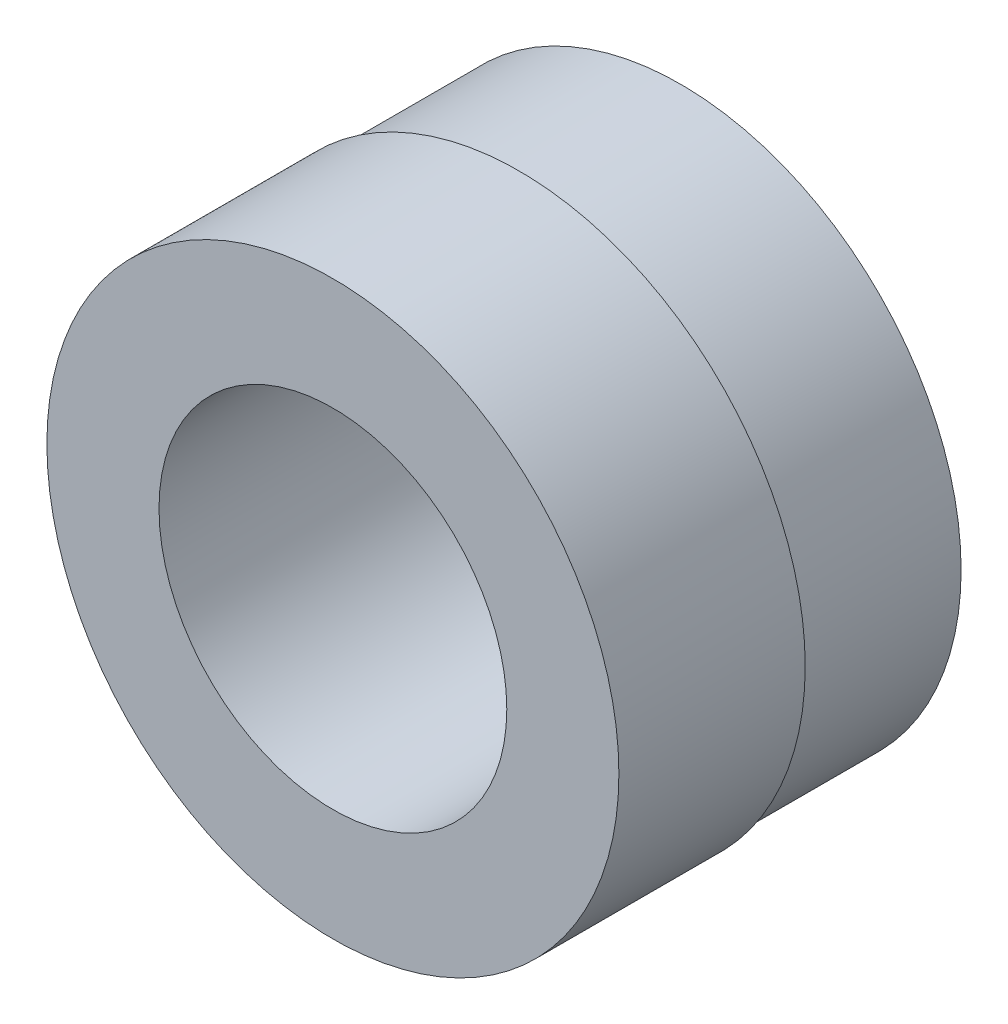
ISO-10303-21;
HEADER;
FILE_DESCRIPTION(('STEP AP214'),'2;1');
FILE_NAME('part.step','',(''),(''),'','','');
FILE_SCHEMA(('AUTOMOTIVE_DESIGN { 1 0 10303 214 1 1 1 1 }'));
ENDSEC;
DATA;
#1=APPLICATION_CONTEXT('core data for automotive mechanical design processes');
#2=APPLICATION_PROTOCOL_DEFINITION('international standard','automotive_design',2000,#1);
#3=PRODUCT_CONTEXT('',#1,'mechanical');
#4=PRODUCT('Part','Part','',(#3));
#5=PRODUCT_RELATED_PRODUCT_CATEGORY('part','',(#4));
#6=PRODUCT_DEFINITION_FORMATION('','',#4);
#7=PRODUCT_DEFINITION_CONTEXT('part definition',#1,'design');
#8=PRODUCT_DEFINITION('design','',#6,#7);
#9=PRODUCT_DEFINITION_SHAPE('','',#8);
#10=(LENGTH_UNIT() NAMED_UNIT(*) SI_UNIT(.MILLI.,.METRE.));
#11=(NAMED_UNIT(*) PLANE_ANGLE_UNIT() SI_UNIT($,.RADIAN.));
#12=(NAMED_UNIT(*) SI_UNIT($,.STERADIAN.) SOLID_ANGLE_UNIT());
#13=UNCERTAINTY_MEASURE_WITH_UNIT(LENGTH_MEASURE(1.E-05),#10,'distance_accuracy_value','');
#14=(GEOMETRIC_REPRESENTATION_CONTEXT(3) GLOBAL_UNCERTAINTY_ASSIGNED_CONTEXT((#13)) GLOBAL_UNIT_ASSIGNED_CONTEXT((#10,
#11,#12)) REPRESENTATION_CONTEXT('',''));
#15=CARTESIAN_POINT('',(0.,0.,0.));
#16=DIRECTION('',(0.,0.,1.));
#17=DIRECTION('',(1.,0.,0.));
#18=AXIS2_PLACEMENT_3D('',#15,#16,#17);
#19=CARTESIAN_POINT('',(23.025,0.,13.));
#20=DIRECTION('',(0.,0.,-1.));
#21=DIRECTION('',(-1.,0.,0.));
#22=AXIS2_PLACEMENT_3D('',#19,#20,#21);
#23=PLANE('',#22);
#24=CARTESIAN_POINT('',(0.,0.,13.));
#25=DIRECTION('',(0.,0.,1.));
#26=DIRECTION('',(1.,0.,0.));
#27=AXIS2_PLACEMENT_3D('',#24,#25,#26);
#28=CIRCLE('',#27,23.025);
#29=CARTESIAN_POINT('',(23.025,0.,13.));
#30=VERTEX_POINT('',#29);
#31=EDGE_CURVE('E11',#30,#30,#28,.T.);
#32=ORIENTED_EDGE('',*,*,#31,.F.);
#33=EDGE_LOOP('',(#32));
#34=FACE_BOUND('',#33,.T.);
#35=CARTESIAN_POINT('',(0.,0.,13.));
#36=DIRECTION('',(0.,0.,-1.));
#37=DIRECTION('',(-1.,0.,0.));
#38=AXIS2_PLACEMENT_3D('',#35,#36,#37);
#39=CIRCLE('',#38,22.575);
#40=CARTESIAN_POINT('',(22.575,0.,13.));
#41=VERTEX_POINT('',#40);
#42=EDGE_CURVE('E101',#41,#41,#39,.T.);
#43=ORIENTED_EDGE('',*,*,#42,.F.);
#44=EDGE_LOOP('',(#43));
#45=FACE_BOUND('',#44,.T.);
#46=ADVANCED_FACE('F35',(#34,#45),#23,.T.);
#47=CARTESIAN_POINT('',(0.,0.,13.));
#48=DIRECTION('',(0.,0.,1.));
#49=DIRECTION('',(1.,0.,0.));
#50=AXIS2_PLACEMENT_3D('',#47,#48,#49);
#51=CYLINDRICAL_SURFACE('',#50,23.025);
#52=ORIENTED_EDGE('',*,*,#31,.T.);
#53=EDGE_LOOP('',(#52));
#54=FACE_BOUND('',#53,.T.);
#55=CARTESIAN_POINT('',(0.,0.,28.));
#56=DIRECTION('',(0.,0.,1.));
#57=DIRECTION('',(1.,0.,0.));
#58=AXIS2_PLACEMENT_3D('',#55,#56,#57);
#59=CIRCLE('',#58,23.025);
#60=CARTESIAN_POINT('',(23.025,0.,28.));
#61=VERTEX_POINT('',#60);
#62=EDGE_CURVE('E43',#61,#61,#59,.T.);
#63=ORIENTED_EDGE('',*,*,#62,.F.);
#64=EDGE_LOOP('',(#63));
#65=FACE_BOUND('',#64,.T.);
#66=ADVANCED_FACE('F37',(#54,#65),#51,.T.);
#67=CARTESIAN_POINT('',(0.,0.,28.));
#68=DIRECTION('',(0.,0.,1.));
#69=DIRECTION('',(1.,0.,0.));
#70=AXIS2_PLACEMENT_3D('',#67,#68,#69);
#71=PLANE('',#70);
#72=CARTESIAN_POINT('',(0.,0.,28.));
#73=DIRECTION('',(0.,0.,1.));
#74=DIRECTION('',(1.,0.,0.));
#75=AXIS2_PLACEMENT_3D('',#72,#73,#74);
#76=CIRCLE('',#75,14.);
#77=CARTESIAN_POINT('',(14.,0.,28.));
#78=VERTEX_POINT('',#77);
#79=EDGE_CURVE('E89',#78,#78,#76,.T.);
#80=ORIENTED_EDGE('',*,*,#79,.F.);
#81=EDGE_LOOP('',(#80));
#82=FACE_BOUND('',#81,.T.);
#83=ORIENTED_EDGE('',*,*,#62,.T.);
#84=EDGE_LOOP('',(#83));
#85=FACE_BOUND('',#84,.T.);
#86=ADVANCED_FACE('F109',(#82,#85),#71,.T.);
#87=CARTESIAN_POINT('',(0.,0.,0.));
#88=DIRECTION('',(0.,0.,1.));
#89=DIRECTION('',(1.,0.,0.));
#90=AXIS2_PLACEMENT_3D('',#87,#88,#89);
#91=CYLINDRICAL_SURFACE('',#90,22.575);
#92=CARTESIAN_POINT('',(0.,0.,0.));
#93=DIRECTION('',(0.,0.,-1.));
#94=DIRECTION('',(-1.,0.,0.));
#95=AXIS2_PLACEMENT_3D('',#92,#93,#94);
#96=CIRCLE('',#95,22.575);
#97=CARTESIAN_POINT('',(22.575,0.,0.));
#98=VERTEX_POINT('',#97);
#99=EDGE_CURVE('E102',#98,#98,#96,.T.);
#100=CARTESIAN_POINT('',(22.575,0.,0.));
#101=CARTESIAN_POINT('',(22.575,0.,0.135416666666667));
#102=CARTESIAN_POINT('',(22.575,0.,0.270833333333333));
#103=CARTESIAN_POINT('',(22.575,0.,0.541666666666667));
#104=CARTESIAN_POINT('',(22.575,0.,0.677083333333334));
#105=CARTESIAN_POINT('',(22.575,0.,0.947916666666667));
#106=CARTESIAN_POINT('',(22.575,0.,1.08333333333333));
#107=CARTESIAN_POINT('',(22.575,0.,1.35416666666667));
#108=CARTESIAN_POINT('',(22.575,0.,1.48958333333333));
#109=CARTESIAN_POINT('',(22.575,0.,1.76041666666667));
#110=CARTESIAN_POINT('',(22.575,0.,1.89583333333333));
#111=CARTESIAN_POINT('',(22.575,0.,2.16666666666667));
#112=CARTESIAN_POINT('',(22.575,0.,2.30208333333333));
#113=CARTESIAN_POINT('',(22.575,0.,2.57291666666667));
#114=CARTESIAN_POINT('',(22.575,0.,2.70833333333333));
#115=CARTESIAN_POINT('',(22.575,0.,2.97916666666667));
#116=CARTESIAN_POINT('',(22.575,0.,3.11458333333333));
#117=CARTESIAN_POINT('',(22.575,0.,3.38541666666667));
#118=CARTESIAN_POINT('',(22.575,0.,3.52083333333333));
#119=CARTESIAN_POINT('',(22.575,0.,3.79166666666667));
#120=CARTESIAN_POINT('',(22.575,0.,3.92708333333334));
#121=CARTESIAN_POINT('',(22.575,0.,4.19791666666667));
#122=CARTESIAN_POINT('',(22.575,0.,4.33333333333334));
#123=CARTESIAN_POINT('',(22.575,0.,4.60416666666667));
#124=CARTESIAN_POINT('',(22.575,0.,4.73958333333333));
#125=CARTESIAN_POINT('',(22.575,0.,5.01041666666667));
#126=CARTESIAN_POINT('',(22.575,0.,5.14583333333334));
#127=CARTESIAN_POINT('',(22.575,0.,5.41666666666667));
#128=CARTESIAN_POINT('',(22.575,0.,5.55208333333334));
#129=CARTESIAN_POINT('',(22.575,0.,5.82291666666667));
#130=CARTESIAN_POINT('',(22.575,0.,5.95833333333334));
#131=CARTESIAN_POINT('',(22.575,0.,6.22916666666667));
#132=CARTESIAN_POINT('',(22.575,0.,6.36458333333334));
#133=CARTESIAN_POINT('',(22.575,0.,6.63541666666667));
#134=CARTESIAN_POINT('',(22.575,0.,6.77083333333334));
#135=CARTESIAN_POINT('',(22.575,0.,7.04166666666667));
#136=CARTESIAN_POINT('',(22.575,0.,7.17708333333334));
#137=CARTESIAN_POINT('',(22.575,0.,7.44791666666667));
#138=CARTESIAN_POINT('',(22.575,0.,7.58333333333334));
#139=CARTESIAN_POINT('',(22.575,0.,7.85416666666667));
#140=CARTESIAN_POINT('',(22.575,0.,7.98958333333334));
#141=CARTESIAN_POINT('',(22.575,0.,8.26041666666667));
#142=CARTESIAN_POINT('',(22.575,0.,8.39583333333334));
#143=CARTESIAN_POINT('',(22.575,0.,8.66666666666667));
#144=CARTESIAN_POINT('',(22.575,0.,8.80208333333334));
#145=CARTESIAN_POINT('',(22.575,0.,9.07291666666667));
#146=CARTESIAN_POINT('',(22.575,0.,9.20833333333334));
#147=CARTESIAN_POINT('',(22.575,0.,9.47916666666667));
#148=CARTESIAN_POINT('',(22.575,0.,9.61458333333334));
#149=CARTESIAN_POINT('',(22.575,0.,9.88541666666667));
#150=CARTESIAN_POINT('',(22.575,0.,10.0208333333333));
#151=CARTESIAN_POINT('',(22.575,0.,10.2916666666667));
#152=CARTESIAN_POINT('',(22.575,0.,10.4270833333333));
#153=CARTESIAN_POINT('',(22.575,0.,10.6979166666667));
#154=CARTESIAN_POINT('',(22.575,0.,10.8333333333333));
#155=CARTESIAN_POINT('',(22.575,0.,11.1041666666667));
#156=CARTESIAN_POINT('',(22.575,0.,11.2395833333333));
#157=CARTESIAN_POINT('',(22.575,0.,11.5104166666667));
#158=CARTESIAN_POINT('',(22.575,0.,11.6458333333333));
#159=CARTESIAN_POINT('',(22.575,0.,11.9166666666667));
#160=CARTESIAN_POINT('',(22.575,0.,12.0520833333333));
#161=CARTESIAN_POINT('',(22.575,0.,12.3229166666667));
#162=CARTESIAN_POINT('',(22.575,0.,12.4583333333333));
#163=CARTESIAN_POINT('',(22.575,0.,12.7291666666667));
#164=CARTESIAN_POINT('',(22.575,0.,12.8645833333333));
#165=CARTESIAN_POINT('',(22.575,0.,13.));
#166=B_SPLINE_CURVE_WITH_KNOTS('',3,(#100,#101,#102,#103,#104,#105,#106,#107,#108,#109,#110,
#111,#112,#113,#114,#115,#116,#117,#118,#119,#120,#121,#122,#123,#124,#125,#126,#127,#128,#129,
#130,#131,#132,#133,#134,#135,#136,#137,#138,#139,#140,#141,#142,#143,#144,#145,#146,#147,#148,
#149,#150,#151,#152,#153,#154,#155,#156,#157,#158,#159,#160,#161,#162,#163,#164,#165),
.UNSPECIFIED.,.F.,.F.,(4,2,2,2,2,2,2,2,2,2,2,2,2,2,2,2,2,2,2,2,2,2,2,2,2,2,2,2,2,2,2,2,4),(0.,
0.40625,0.8125,1.21875,1.625,2.03125,2.4375,2.84375,3.25,3.65625,4.0625,4.46875,4.875,5.28125,
5.6875,6.09375,6.5,6.90625,7.3125,7.71875,8.125,8.53125,8.93750000000001,9.34375000000001,9.75,
10.15625,10.5625,10.96875,11.375,11.78125,12.1875,12.59375,13.),.UNSPECIFIED.);
#167=EDGE_CURVE('BSEAM117',#98,#41,#166,.T.);
#168=ORIENTED_EDGE('',*,*,#99,.F.);
#169=ORIENTED_EDGE('',*,*,#42,.T.);
#170=ORIENTED_EDGE('',*,*,#167,.T.);
#171=ORIENTED_EDGE('',*,*,#167,.F.);
#172=EDGE_LOOP('',(#168,#170,#169,#171));
#173=FACE_BOUND('',#172,.T.);
#174=ADVANCED_FACE('F117',(#173),#91,.T.);
#175=CARTESIAN_POINT('',(0.,0.,0.));
#176=DIRECTION('',(0.,0.,-1.));
#177=DIRECTION('',(-1.,0.,0.));
#178=AXIS2_PLACEMENT_3D('',#175,#176,#177);
#179=PLANE('',#178);
#180=CARTESIAN_POINT('',(0.,17.5,0.));
#181=DIRECTION('',(0.,0.,-1.));
#182=DIRECTION('',(-1.,0.,0.));
#183=AXIS2_PLACEMENT_3D('',#180,#181,#182);
#184=CIRCLE('',#183,1.22949999999999);
#185=CARTESIAN_POINT('',(-1.22949999999999,17.5,0.));
#186=VERTEX_POINT('',#185);
#187=EDGE_CURVE('E67',#186,#186,#184,.T.);
#188=ORIENTED_EDGE('',*,*,#187,.F.);
#189=EDGE_LOOP('',(#188));
#190=FACE_BOUND('',#189,.T.);
#191=CARTESIAN_POINT('',(17.5,0.,0.));
#192=DIRECTION('',(0.,0.,-1.));
#193=DIRECTION('',(-1.,0.,0.));
#194=AXIS2_PLACEMENT_3D('',#191,#192,#193);
#195=CIRCLE('',#194,1.22949999999999);
#196=CARTESIAN_POINT('',(16.2705,0.,0.));
#197=VERTEX_POINT('',#196);
#198=EDGE_CURVE('E66',#197,#197,#195,.T.);
#199=ORIENTED_EDGE('',*,*,#198,.F.);
#200=EDGE_LOOP('',(#199));
#201=FACE_BOUND('',#200,.T.);
#202=CARTESIAN_POINT('',(0.,-17.5,0.));
#203=DIRECTION('',(0.,0.,-1.));
#204=DIRECTION('',(-1.,0.,0.));
#205=AXIS2_PLACEMENT_3D('',#202,#203,#204);
#206=CIRCLE('',#205,1.22949999999999);
#207=CARTESIAN_POINT('',(-1.22949999999999,-17.5,0.));
#208=VERTEX_POINT('',#207);
#209=EDGE_CURVE('E77',#208,#208,#206,.T.);
#210=ORIENTED_EDGE('',*,*,#209,.F.);
#211=EDGE_LOOP('',(#210));
#212=FACE_BOUND('',#211,.T.);
#213=CARTESIAN_POINT('',(-17.5,0.,0.));
#214=DIRECTION('',(0.,0.,-1.));
#215=DIRECTION('',(-1.,0.,0.));
#216=AXIS2_PLACEMENT_3D('',#213,#214,#215);
#217=CIRCLE('',#216,1.22949999999999);
#218=CARTESIAN_POINT('',(-18.7295,0.,0.));
#219=VERTEX_POINT('',#218);
#220=EDGE_CURVE('E83',#219,#219,#217,.T.);
#221=ORIENTED_EDGE('',*,*,#220,.F.);
#222=EDGE_LOOP('',(#221));
#223=FACE_BOUND('',#222,.T.);
#224=CARTESIAN_POINT('',(0.,0.,0.));
#225=DIRECTION('',(0.,0.,1.));
#226=DIRECTION('',(1.,0.,0.));
#227=AXIS2_PLACEMENT_3D('',#224,#225,#226);
#228=CIRCLE('',#227,10.);
#229=CARTESIAN_POINT('',(10.,0.,0.));
#230=VERTEX_POINT('',#229);
#231=EDGE_CURVE('E98',#230,#230,#228,.T.);
#232=ORIENTED_EDGE('',*,*,#231,.T.);
#233=EDGE_LOOP('',(#232));
#234=FACE_BOUND('',#233,.T.);
#235=ORIENTED_EDGE('',*,*,#99,.T.);
#236=EDGE_LOOP('',(#235));
#237=FACE_BOUND('',#236,.T.);
#238=ADVANCED_FACE('F126',(#190,#201,#212,#223,#234,#237),#179,.T.);
#239=CARTESIAN_POINT('',(0.,0.,28.));
#240=DIRECTION('',(0.,0.,1.));
#241=DIRECTION('',(1.,0.,0.));
#242=AXIS2_PLACEMENT_3D('',#239,#240,#241);
#243=CYLINDRICAL_SURFACE('',#242,10.);
#244=ORIENTED_EDGE('',*,*,#231,.F.);
#245=EDGE_LOOP('',(#244));
#246=FACE_BOUND('',#245,.T.);
#247=CARTESIAN_POINT('',(0.,0.,0.999999999999997));
#248=DIRECTION('',(0.,0.,1.));
#249=DIRECTION('',(1.,0.,0.));
#250=AXIS2_PLACEMENT_3D('',#247,#248,#249);
#251=CIRCLE('',#250,10.);
#252=CARTESIAN_POINT('',(10.,0.,0.999999999999997));
#253=VERTEX_POINT('',#252);
#254=EDGE_CURVE('E95',#253,#253,#251,.T.);
#255=ORIENTED_EDGE('',*,*,#254,.T.);
#256=EDGE_LOOP('',(#255));
#257=FACE_BOUND('',#256,.T.);
#258=ADVANCED_FACE('F132',(#246,#257),#243,.F.);
#259=CARTESIAN_POINT('',(10.,0.,0.999999999999999));
#260=DIRECTION('',(0.,0.,-1.));
#261=DIRECTION('',(-1.,0.,0.));
#262=AXIS2_PLACEMENT_3D('',#259,#260,#261);
#263=PLANE('',#262);
#264=ORIENTED_EDGE('',*,*,#254,.F.);
#265=EDGE_LOOP('',(#264));
#266=FACE_BOUND('',#265,.T.);
#267=CARTESIAN_POINT('',(0.,0.,1.));
#268=DIRECTION('',(0.,0.,1.));
#269=DIRECTION('',(1.,0.,0.));
#270=AXIS2_PLACEMENT_3D('',#267,#268,#269);
#271=CIRCLE('',#270,14.);
#272=CARTESIAN_POINT('',(14.,0.,1.));
#273=VERTEX_POINT('',#272);
#274=EDGE_CURVE('E92',#273,#273,#271,.T.);
#275=ORIENTED_EDGE('',*,*,#274,.T.);
#276=EDGE_LOOP('',(#275));
#277=FACE_BOUND('',#276,.T.);
#278=ADVANCED_FACE('F139',(#266,#277),#263,.F.);
#279=CARTESIAN_POINT('',(0.,0.,28.));
#280=DIRECTION('',(0.,0.,1.));
#281=DIRECTION('',(1.,0.,0.));
#282=AXIS2_PLACEMENT_3D('',#279,#280,#281);
#283=CYLINDRICAL_SURFACE('',#282,14.);
#284=ORIENTED_EDGE('',*,*,#274,.F.);
#285=EDGE_LOOP('',(#284));
#286=FACE_BOUND('',#285,.T.);
#287=ORIENTED_EDGE('',*,*,#79,.T.);
#288=EDGE_LOOP('',(#287));
#289=FACE_BOUND('',#288,.T.);
#290=ADVANCED_FACE('F143',(#286,#289),#283,.F.);
#291=CARTESIAN_POINT('',(-17.5,0.,14.9999999992766));
#292=DIRECTION('',(0.,0.,-1.));
#293=DIRECTION('',(-1.,0.,0.));
#294=AXIS2_PLACEMENT_3D('',#291,#292,#293);
#295=CONICAL_SURFACE('',#294,1.22949999999999,1.02974425749999);
#296=CARTESIAN_POINT('',(-17.5,0.,15.73875813234));
#297=VERTEX_POINT('',#296);
#298=VERTEX_LOOP('',#297);
#299=FACE_BOUND('',#298,.T.);
#300=CARTESIAN_POINT('',(-17.5,0.,14.9999999992766));
#301=DIRECTION('',(0.,0.,-1.));
#302=DIRECTION('',(-1.,0.,0.));
#303=AXIS2_PLACEMENT_3D('',#300,#301,#302);
#304=CIRCLE('',#303,1.22949999999999);
#305=CARTESIAN_POINT('',(-18.7295,0.,14.9999999992766));
#306=VERTEX_POINT('',#305);
#307=EDGE_CURVE('E86',#306,#306,#304,.T.);
#308=ORIENTED_EDGE('',*,*,#307,.T.);
#309=EDGE_LOOP('',(#308));
#310=FACE_BOUND('',#309,.T.);
#311=ADVANCED_FACE('F147',(#299,#310),#295,.F.);
#312=CARTESIAN_POINT('',(-17.5,0.,0.));
#313=DIRECTION('',(0.,0.,-1.));
#314=DIRECTION('',(-1.,0.,0.));
#315=AXIS2_PLACEMENT_3D('',#312,#313,#314);
#316=CYLINDRICAL_SURFACE('',#315,1.22949999999999);
#317=ORIENTED_EDGE('',*,*,#307,.F.);
#318=EDGE_LOOP('',(#317));
#319=FACE_BOUND('',#318,.T.);
#320=ORIENTED_EDGE('',*,*,#220,.T.);
#321=EDGE_LOOP('',(#320));
#322=FACE_BOUND('',#321,.T.);
#323=ADVANCED_FACE('F151',(#319,#322),#316,.F.);
#324=CARTESIAN_POINT('',(0.,-17.5,14.9999999992766));
#325=DIRECTION('',(0.,0.,-1.));
#326=DIRECTION('',(-1.,0.,0.));
#327=AXIS2_PLACEMENT_3D('',#324,#325,#326);
#328=CONICAL_SURFACE('',#327,1.22949999999999,1.02974425749999);
#329=CARTESIAN_POINT('',(0.,-17.5,15.73875813234));
#330=VERTEX_POINT('',#329);
#331=VERTEX_LOOP('',#330);
#332=FACE_BOUND('',#331,.T.);
#333=CARTESIAN_POINT('',(0.,-17.5,14.9999999992766));
#334=DIRECTION('',(0.,0.,-1.));
#335=DIRECTION('',(-1.,0.,0.));
#336=AXIS2_PLACEMENT_3D('',#333,#334,#335);
#337=CIRCLE('',#336,1.22949999999999);
#338=CARTESIAN_POINT('',(-1.22949999999999,-17.5,14.9999999992766));
#339=VERTEX_POINT('',#338);
#340=EDGE_CURVE('E80',#339,#339,#337,.T.);
#341=ORIENTED_EDGE('',*,*,#340,.T.);
#342=EDGE_LOOP('',(#341));
#343=FACE_BOUND('',#342,.T.);
#344=ADVANCED_FACE('F154',(#332,#343),#328,.F.);
#345=CARTESIAN_POINT('',(0.,-17.5,0.));
#346=DIRECTION('',(0.,0.,-1.));
#347=DIRECTION('',(-1.,0.,0.));
#348=AXIS2_PLACEMENT_3D('',#345,#346,#347);
#349=CYLINDRICAL_SURFACE('',#348,1.22949999999999);
#350=ORIENTED_EDGE('',*,*,#340,.F.);
#351=EDGE_LOOP('',(#350));
#352=FACE_BOUND('',#351,.T.);
#353=ORIENTED_EDGE('',*,*,#209,.T.);
#354=EDGE_LOOP('',(#353));
#355=FACE_BOUND('',#354,.T.);
#356=ADVANCED_FACE('F158',(#352,#355),#349,.F.);
#357=CARTESIAN_POINT('',(17.5,0.,14.9999999992766));
#358=DIRECTION('',(0.,0.,-1.));
#359=DIRECTION('',(-1.,0.,0.));
#360=AXIS2_PLACEMENT_3D('',#357,#358,#359);
#361=CONICAL_SURFACE('',#360,1.22949999999999,1.02974425749999);
#362=CARTESIAN_POINT('',(17.5,0.,15.73875813234));
#363=VERTEX_POINT('',#362);
#364=VERTEX_LOOP('',#363);
#365=FACE_BOUND('',#364,.T.);
#366=CARTESIAN_POINT('',(17.5,0.,14.9999999992766));
#367=DIRECTION('',(0.,0.,-1.));
#368=DIRECTION('',(-1.,0.,0.));
#369=AXIS2_PLACEMENT_3D('',#366,#367,#368);
#370=CIRCLE('',#369,1.22949999999999);
#371=CARTESIAN_POINT('',(16.2705,0.,14.9999999992766));
#372=VERTEX_POINT('',#371);
#373=EDGE_CURVE('E70',#372,#372,#370,.T.);
#374=ORIENTED_EDGE('',*,*,#373,.T.);
#375=EDGE_LOOP('',(#374));
#376=FACE_BOUND('',#375,.T.);
#377=ADVANCED_FACE('F161',(#365,#376),#361,.F.);
#378=CARTESIAN_POINT('',(17.5,0.,0.));
#379=DIRECTION('',(0.,0.,-1.));
#380=DIRECTION('',(-1.,0.,0.));
#381=AXIS2_PLACEMENT_3D('',#378,#379,#380);
#382=CYLINDRICAL_SURFACE('',#381,1.22949999999999);
#383=ORIENTED_EDGE('',*,*,#373,.F.);
#384=EDGE_LOOP('',(#383));
#385=FACE_BOUND('',#384,.T.);
#386=ORIENTED_EDGE('',*,*,#198,.T.);
#387=EDGE_LOOP('',(#386));
#388=FACE_BOUND('',#387,.T.);
#389=ADVANCED_FACE('F60',(#385,#388),#382,.F.);
#390=CARTESIAN_POINT('',(0.,17.5,14.9999999992766));
#391=DIRECTION('',(0.,0.,-1.));
#392=DIRECTION('',(-1.,0.,0.));
#393=AXIS2_PLACEMENT_3D('',#390,#391,#392);
#394=CONICAL_SURFACE('',#393,1.22949999999999,1.02974425749999);
#395=CARTESIAN_POINT('',(0.,17.5,15.73875813234));
#396=VERTEX_POINT('',#395);
#397=VERTEX_LOOP('',#396);
#398=FACE_BOUND('',#397,.T.);
#399=CARTESIAN_POINT('',(0.,17.5,14.9999999992766));
#400=DIRECTION('',(0.,0.,-1.));
#401=DIRECTION('',(-1.,0.,0.));
#402=AXIS2_PLACEMENT_3D('',#399,#400,#401);
#403=CIRCLE('',#402,1.22949999999999);
#404=CARTESIAN_POINT('',(-1.22949999999999,17.5,14.9999999992766));
#405=VERTEX_POINT('',#404);
#406=EDGE_CURVE('E64',#405,#405,#403,.T.);
#407=ORIENTED_EDGE('',*,*,#406,.T.);
#408=EDGE_LOOP('',(#407));
#409=FACE_BOUND('',#408,.T.);
#410=ADVANCED_FACE('F56',(#398,#409),#394,.F.);
#411=CARTESIAN_POINT('',(0.,17.5,0.));
#412=DIRECTION('',(0.,0.,-1.));
#413=DIRECTION('',(-1.,0.,0.));
#414=AXIS2_PLACEMENT_3D('',#411,#412,#413);
#415=CYLINDRICAL_SURFACE('',#414,1.22949999999999);
#416=ORIENTED_EDGE('',*,*,#406,.F.);
#417=EDGE_LOOP('',(#416));
#418=FACE_BOUND('',#417,.T.);
#419=ORIENTED_EDGE('',*,*,#187,.T.);
#420=EDGE_LOOP('',(#419));
#421=FACE_BOUND('',#420,.T.);
#422=ADVANCED_FACE('F59',(#418,#421),#415,.F.);
#423=CLOSED_SHELL('',(#46,#66,#86,#174,#238,#258,#278,#290,#311,#323,#344,#356,#377,#389,#410,#422));
#424=MANIFOLD_SOLID_BREP('B2',#423);
#425=ADVANCED_BREP_SHAPE_REPRESENTATION('',(#18,#424),#14);
#426=SHAPE_DEFINITION_REPRESENTATION(#9,#425);
ENDSEC;
END-ISO-10303-21;
